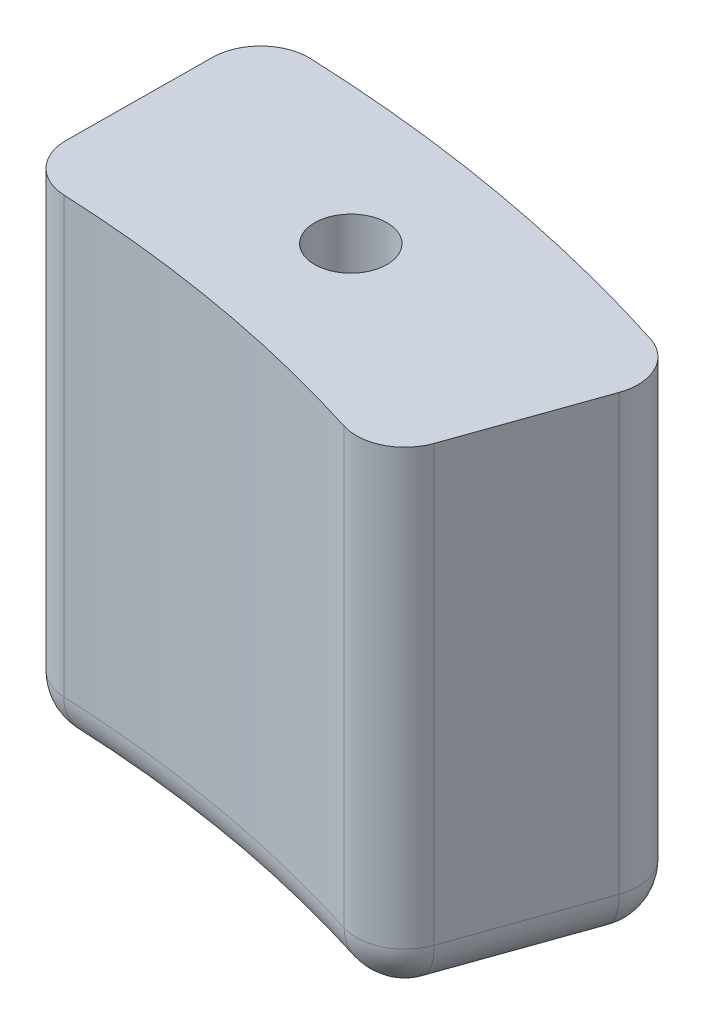
ISO-10303-21;
HEADER;
FILE_DESCRIPTION(('STEP AP214'),'2;1');
FILE_NAME('part.step','',(''),(''),'','','');
FILE_SCHEMA(('AUTOMOTIVE_DESIGN { 1 0 10303 214 1 1 1 1 }'));
ENDSEC;
DATA;
#1=APPLICATION_CONTEXT('core data for automotive mechanical design processes');
#2=APPLICATION_PROTOCOL_DEFINITION('international standard','automotive_design',2000,#1);
#3=PRODUCT_CONTEXT('',#1,'mechanical');
#4=PRODUCT('Part','Part','',(#3));
#5=PRODUCT_RELATED_PRODUCT_CATEGORY('part','',(#4));
#6=PRODUCT_DEFINITION_FORMATION('','',#4);
#7=PRODUCT_DEFINITION_CONTEXT('part definition',#1,'design');
#8=PRODUCT_DEFINITION('design','',#6,#7);
#9=PRODUCT_DEFINITION_SHAPE('','',#8);
#10=(LENGTH_UNIT() NAMED_UNIT(*) SI_UNIT(.MILLI.,.METRE.));
#11=(NAMED_UNIT(*) PLANE_ANGLE_UNIT() SI_UNIT($,.RADIAN.));
#12=(NAMED_UNIT(*) SI_UNIT($,.STERADIAN.) SOLID_ANGLE_UNIT());
#13=UNCERTAINTY_MEASURE_WITH_UNIT(LENGTH_MEASURE(1.E-05),#10,'distance_accuracy_value','');
#14=(GEOMETRIC_REPRESENTATION_CONTEXT(3) GLOBAL_UNCERTAINTY_ASSIGNED_CONTEXT((#13)) GLOBAL_UNIT_ASSIGNED_CONTEXT((#10,
#11,#12)) REPRESENTATION_CONTEXT('',''));
#15=CARTESIAN_POINT('',(0.,0.,0.));
#16=DIRECTION('',(0.,0.,1.));
#17=DIRECTION('',(1.,0.,0.));
#18=AXIS2_PLACEMENT_3D('',#15,#16,#17);
#19=CARTESIAN_POINT('',(0.,20.,0.));
#20=DIRECTION('',(-0.942735748784033,0.,-0.333540564196634));
#21=DIRECTION('',(-0.333540564196634,0.,0.942735748784033));
#22=AXIS2_PLACEMENT_3D('',#19,#20,#21);
#23=PLANE('',#22);
#24=DIRECTION('',(0.333540564196634,0.,-0.942735748784033));
#25=VECTOR('',#24,1.);
#26=CARTESIAN_POINT('',(0.,2.,0.));
#27=LINE('',#26,#25);
#28=CARTESIAN_POINT('',(19.0001053772119,2.,-53.7028490459756));
#29=VERTEX_POINT('',#28);
#30=CARTESIAN_POINT('',(21.0024642858802,2.,-59.3624165101146));
#31=VERTEX_POINT('',#30);
#32=EDGE_CURVE('E159',#29,#31,#27,.T.);
#33=ORIENTED_EDGE('',*,*,#32,.T.);
#34=DIRECTION('',(0.,-1.,0.));
#35=VECTOR('',#34,1.);
#36=CARTESIAN_POINT('',(21.0024642858802,20.,-59.3624165101146));
#37=LINE('',#36,#35);
#38=CARTESIAN_POINT('',(21.0024642858802,20.,-59.3624165101146));
#39=VERTEX_POINT('',#38);
#40=EDGE_CURVE('E161',#31,#39,#37,.F.);
#41=ORIENTED_EDGE('',*,*,#40,.T.);
#42=DIRECTION('',(0.333540564196634,0.,-0.942735748784033));
#43=VECTOR('',#42,1.);
#44=CARTESIAN_POINT('',(0.,20.,0.));
#45=LINE('',#44,#43);
#46=CARTESIAN_POINT('',(19.0001053772119,20.,-53.7028490459756));
#47=VERTEX_POINT('',#46);
#48=EDGE_CURVE('E198',#47,#39,#45,.T.);
#49=ORIENTED_EDGE('',*,*,#48,.F.);
#50=DIRECTION('',(0.,1.,0.));
#51=VECTOR('',#50,1.);
#52=CARTESIAN_POINT('',(19.0001053772119,0.,-53.7028490459756));
#53=LINE('',#52,#51);
#54=EDGE_CURVE('E157',#47,#29,#53,.F.);
#55=ORIENTED_EDGE('',*,*,#54,.T.);
#56=EDGE_LOOP('',(#33,#41,#49,#55));
#57=FACE_BOUND('',#56,.T.);
#58=ADVANCED_FACE('F37',(#57),#23,.F.);
#59=CARTESIAN_POINT('',(0.,20.,0.));
#60=DIRECTION('',(0.,-1.,0.));
#61=DIRECTION('',(0.,0.,-1.));
#62=AXIS2_PLACEMENT_3D('',#59,#60,#61);
#63=CYLINDRICAL_SURFACE('',#62,65.);
#64=CARTESIAN_POINT('',(0.,2.,0.));
#65=DIRECTION('',(0.,1.,0.));
#66=DIRECTION('',(0.,0.,1.));
#67=AXIS2_PLACEMENT_3D('',#64,#65,#66);
#68=CIRCLE('',#67,65.);
#69=CARTESIAN_POINT('',(19.7238814482586,2.,-61.9351959762383));
#70=VERTEX_POINT('',#69);
#71=CARTESIAN_POINT('',(2.64869875451225,2.,-64.9460113856721));
#72=VERTEX_POINT('',#71);
#73=EDGE_CURVE('E142',#70,#72,#68,.T.);
#74=ORIENTED_EDGE('',*,*,#73,.T.);
#75=DIRECTION('',(0.,-1.,0.));
#76=VECTOR('',#75,1.);
#77=CARTESIAN_POINT('',(2.64869875451225,20.,-64.9460113856721));
#78=LINE('',#77,#76);
#79=CARTESIAN_POINT('',(2.64869875451225,20.,-64.9460113856721));
#80=VERTEX_POINT('',#79);
#81=EDGE_CURVE('E138',#72,#80,#78,.F.);
#82=ORIENTED_EDGE('',*,*,#81,.T.);
#83=CARTESIAN_POINT('',(0.,20.,0.));
#84=DIRECTION('',(0.,1.,0.));
#85=DIRECTION('',(0.,0.,1.));
#86=AXIS2_PLACEMENT_3D('',#83,#84,#85);
#87=CIRCLE('',#86,65.);
#88=CARTESIAN_POINT('',(19.7238814482586,20.,-61.9351959762383));
#89=VERTEX_POINT('',#88);
#90=EDGE_CURVE('E134',#89,#80,#87,.T.);
#91=ORIENTED_EDGE('',*,*,#90,.F.);
#92=DIRECTION('',(0.,-1.,0.));
#93=VECTOR('',#92,1.);
#94=CARTESIAN_POINT('',(19.7238814482586,20.,-61.9351959762383));
#95=LINE('',#94,#93);
#96=EDGE_CURVE('E215',#89,#70,#95,.T.);
#97=ORIENTED_EDGE('',*,*,#96,.T.);
#98=EDGE_LOOP('',(#74,#82,#91,#97));
#99=FACE_BOUND('',#98,.T.);
#100=ADVANCED_FACE('F219',(#99),#63,.T.);
#101=CARTESIAN_POINT('',(0.,20.,0.));
#102=DIRECTION('',(-0.999959418054891,0.,-0.009009009009009));
#103=DIRECTION('',(-0.009009009009009,0.,0.999959418054891));
#104=AXIS2_PLACEMENT_3D('',#101,#102,#103);
#105=PLANE('',#104);
#106=DIRECTION('',(0.009009009009009,0.,-0.999959418054891));
#107=VECTOR('',#106,1.);
#108=CARTESIAN_POINT('',(0.,20.,0.));
#109=LINE('',#108,#107);
#110=CARTESIAN_POINT('',(0.513197310581121,20.,-56.9625897279996));
#111=VERTEX_POINT('',#110);
#112=CARTESIAN_POINT('',(0.567281495186708,20.,-62.9656905918232));
#113=VERTEX_POINT('',#112);
#114=EDGE_CURVE('E117',#111,#113,#109,.T.);
#115=ORIENTED_EDGE('',*,*,#114,.T.);
#116=DIRECTION('',(0.,1.,0.));
#117=VECTOR('',#116,1.);
#118=CARTESIAN_POINT('',(0.567281495186709,0.,-62.9656905918232));
#119=LINE('',#118,#117);
#120=CARTESIAN_POINT('',(0.567281495186709,2.,-62.9656905918232));
#121=VERTEX_POINT('',#120);
#122=EDGE_CURVE('E213',#113,#121,#119,.F.);
#123=ORIENTED_EDGE('',*,*,#122,.T.);
#124=DIRECTION('',(0.009009009009009,0.,-0.999959418054891));
#125=VECTOR('',#124,1.);
#126=CARTESIAN_POINT('',(0.495495495495495,2.,-54.997767993019));
#127=LINE('',#126,#125);
#128=CARTESIAN_POINT('',(0.513197310581121,2.,-56.9625897279997));
#129=VERTEX_POINT('',#128);
#130=EDGE_CURVE('E120',#121,#129,#127,.F.);
#131=ORIENTED_EDGE('',*,*,#130,.T.);
#132=DIRECTION('',(0.,-1.,0.));
#133=VECTOR('',#132,1.);
#134=CARTESIAN_POINT('',(0.513197310581121,20.,-56.9625897279996));
#135=LINE('',#134,#133);
#136=EDGE_CURVE('E113',#129,#111,#135,.F.);
#137=ORIENTED_EDGE('',*,*,#136,.T.);
#138=EDGE_LOOP('',(#115,#123,#131,#137));
#139=FACE_BOUND('',#138,.T.);
#140=ADVANCED_FACE('F115',(#139),#105,.T.);
#141=CARTESIAN_POINT('',(0.,20.,0.));
#142=DIRECTION('',(0.,-1.,0.));
#143=DIRECTION('',(0.,0.,-1.));
#144=AXIS2_PLACEMENT_3D('',#141,#142,#143);
#145=CYLINDRICAL_SURFACE('',#144,55.);
#146=CARTESIAN_POINT('',(0.,2.,0.));
#147=DIRECTION('',(0.,1.,0.));
#148=DIRECTION('',(0.,0.,1.));
#149=AXIS2_PLACEMENT_3D('',#146,#147,#148);
#150=CIRCLE('',#149,55.);
#151=CARTESIAN_POINT('',(2.42493663277192,2.,-54.946516562263));
#152=VERTEX_POINT('',#151);
#153=CARTESIAN_POINT('',(16.5141204101826,2.,-52.4622133261454));
#154=VERTEX_POINT('',#153);
#155=EDGE_CURVE('E46',#152,#154,#150,.F.);
#156=ORIENTED_EDGE('',*,*,#155,.T.);
#157=DIRECTION('',(0.,-1.,0.));
#158=VECTOR('',#157,1.);
#159=CARTESIAN_POINT('',(16.5141204101826,20.,-52.4622133261454));
#160=LINE('',#159,#158);
#161=CARTESIAN_POINT('',(16.5141204101826,20.,-52.4622133261454));
#162=VERTEX_POINT('',#161);
#163=EDGE_CURVE('E11',#154,#162,#160,.F.);
#164=ORIENTED_EDGE('',*,*,#163,.T.);
#165=CARTESIAN_POINT('',(0.,20.,0.));
#166=DIRECTION('',(0.,1.,0.));
#167=DIRECTION('',(0.,0.,1.));
#168=AXIS2_PLACEMENT_3D('',#165,#166,#167);
#169=CIRCLE('',#168,55.);
#170=CARTESIAN_POINT('',(2.42493663277192,20.,-54.946516562263));
#171=VERTEX_POINT('',#170);
#172=EDGE_CURVE('E125',#162,#171,#169,.T.);
#173=ORIENTED_EDGE('',*,*,#172,.T.);
#174=DIRECTION('',(0.,-1.,0.));
#175=VECTOR('',#174,1.);
#176=CARTESIAN_POINT('',(2.42493663277192,20.,-54.946516562263));
#177=LINE('',#176,#175);
#178=EDGE_CURVE('E57',#171,#152,#177,.T.);
#179=ORIENTED_EDGE('',*,*,#178,.T.);
#180=EDGE_LOOP('',(#156,#164,#173,#179));
#181=FACE_BOUND('',#180,.T.);
#182=ADVANCED_FACE('F423',(#181),#145,.F.);
#183=CARTESIAN_POINT('',(0.,20.,0.));
#184=DIRECTION('',(0.,1.,0.));
#185=DIRECTION('',(0.,0.,1.));
#186=AXIS2_PLACEMENT_3D('',#183,#184,#185);
#187=PLANE('',#186);
#188=CARTESIAN_POINT('',(10.1115162077173,20.,-59.1418400117977));
#189=DIRECTION('',(0.,1.,0.));
#190=DIRECTION('',(0.,0.,1.));
#191=AXIS2_PLACEMENT_3D('',#188,#189,#190);
#192=CIRCLE('',#191,1.5);
#193=CARTESIAN_POINT('',(10.1115162077173,20.,-57.6418400117977));
#194=VERTEX_POINT('',#193);
#195=EDGE_CURVE('E208',#194,#194,#192,.T.);
#196=ORIENTED_EDGE('',*,*,#195,.F.);
#197=EDGE_LOOP('',(#196));
#198=FACE_BOUND('',#197,.T.);
#199=ORIENTED_EDGE('',*,*,#90,.T.);
#200=CARTESIAN_POINT('',(2.56720033129649,20.,-62.9476725738052));
#201=DIRECTION('',(0.,1.,0.));
#202=DIRECTION('',(0.,0.,1.));
#203=AXIS2_PLACEMENT_3D('',#200,#201,#202);
#204=CIRCLE('',#203,2.);
#205=EDGE_CURVE('E133',#80,#113,#204,.T.);
#206=ORIENTED_EDGE('',*,*,#205,.T.);
#207=ORIENTED_EDGE('',*,*,#114,.F.);
#208=CARTESIAN_POINT('',(2.5131161466909,20.,-56.9445717099816));
#209=DIRECTION('',(0.,1.,0.));
#210=DIRECTION('',(0.,0.,1.));
#211=AXIS2_PLACEMENT_3D('',#208,#209,#210);
#212=CIRCLE('',#211,2.);
#213=EDGE_CURVE('E131',#111,#171,#212,.T.);
#214=ORIENTED_EDGE('',*,*,#213,.T.);
#215=ORIENTED_EDGE('',*,*,#172,.F.);
#216=CARTESIAN_POINT('',(17.1146338796438,20.,-54.3699301743689));
#217=DIRECTION('',(0.,1.,0.));
#218=DIRECTION('',(0.,0.,1.));
#219=AXIS2_PLACEMENT_3D('',#216,#217,#218);
#220=CIRCLE('',#219,2.);
#221=EDGE_CURVE('E137',#162,#47,#220,.T.);
#222=ORIENTED_EDGE('',*,*,#221,.T.);
#223=ORIENTED_EDGE('',*,*,#48,.T.);
#224=CARTESIAN_POINT('',(19.1169927883122,20.,-60.0294976385079));
#225=DIRECTION('',(0.,1.,0.));
#226=DIRECTION('',(0.,0.,1.));
#227=AXIS2_PLACEMENT_3D('',#224,#225,#226);
#228=CIRCLE('',#227,2.);
#229=EDGE_CURVE('E140',#39,#89,#228,.T.);
#230=ORIENTED_EDGE('',*,*,#229,.T.);
#231=EDGE_LOOP('',(#199,#206,#207,#214,#215,#222,#223,#230));
#232=FACE_BOUND('',#231,.T.);
#233=ADVANCED_FACE('F129',(#198,#232),#187,.T.);
#234=CARTESIAN_POINT('',(0.,0.,0.));
#235=DIRECTION('',(0.,1.,0.));
#236=DIRECTION('',(0.,0.,1.));
#237=AXIS2_PLACEMENT_3D('',#234,#235,#236);
#238=PLANE('',#237);
#239=CARTESIAN_POINT('',(0.,0.,0.));
#240=DIRECTION('',(0.,1.,0.));
#241=DIRECTION('',(0.,0.,1.));
#242=AXIS2_PLACEMENT_3D('',#239,#240,#241);
#243=CIRCLE('',#242,57.);
#244=CARTESIAN_POINT('',(17.1146338796438,0.,-54.3699301743689));
#245=VERTEX_POINT('',#244);
#246=CARTESIAN_POINT('',(2.5131161466909,0.,-56.9445717099816));
#247=VERTEX_POINT('',#246);
#248=EDGE_CURVE('E148',#245,#247,#243,.T.);
#249=ORIENTED_EDGE('',*,*,#248,.T.);
#250=DIRECTION('',(0.009009009009009,0.,-0.999959418054891));
#251=VECTOR('',#250,1.);
#252=CARTESIAN_POINT('',(2.58550442169537,0.,-64.9793441555499));
#253=LINE('',#252,#251);
#254=CARTESIAN_POINT('',(2.56720033129649,0.,-62.9476725738052));
#255=VERTEX_POINT('',#254);
#256=EDGE_CURVE('E154',#247,#255,#253,.T.);
#257=ORIENTED_EDGE('',*,*,#256,.T.);
#258=CARTESIAN_POINT('',(0.,0.,0.));
#259=DIRECTION('',(0.,1.,0.));
#260=DIRECTION('',(0.,0.,1.));
#261=AXIS2_PLACEMENT_3D('',#258,#259,#260);
#262=CIRCLE('',#261,63.);
#263=CARTESIAN_POINT('',(19.1169927883121,0.,-60.0294976385079));
#264=VERTEX_POINT('',#263);
#265=EDGE_CURVE('E152',#255,#264,#262,.F.);
#266=ORIENTED_EDGE('',*,*,#265,.T.);
#267=DIRECTION('',(0.333540564196634,0.,-0.942735748784033));
#268=VECTOR('',#267,1.);
#269=CARTESIAN_POINT('',(-1.88547149756807,0.,-0.667081128393269));
#270=LINE('',#269,#268);
#271=EDGE_CURVE('E150',#264,#245,#270,.F.);
#272=ORIENTED_EDGE('',*,*,#271,.T.);
#273=EDGE_LOOP('',(#249,#257,#266,#272));
#274=FACE_BOUND('',#273,.T.);
#275=ADVANCED_FACE('F242',(#274),#238,.F.);
#276=CARTESIAN_POINT('',(17.1146338796438,20.,-54.3699301743689));
#277=DIRECTION('',(0.,-1.,0.));
#278=DIRECTION('',(0.,0.,-1.));
#279=AXIS2_PLACEMENT_3D('',#276,#277,#278);
#280=CYLINDRICAL_SURFACE('',#279,2.);
#281=CARTESIAN_POINT('',(17.1146338796438,2.,-54.3699301743689));
#282=DIRECTION('',(0.,-1.,0.));
#283=DIRECTION('',(0.,0.,-1.));
#284=AXIS2_PLACEMENT_3D('',#281,#282,#283);
#285=CIRCLE('',#284,2.);
#286=EDGE_CURVE('E41',#29,#154,#285,.T.);
#287=ORIENTED_EDGE('',*,*,#286,.F.);
#288=ORIENTED_EDGE('',*,*,#54,.F.);
#289=ORIENTED_EDGE('',*,*,#221,.F.);
#290=ORIENTED_EDGE('',*,*,#163,.F.);
#291=EDGE_LOOP('',(#287,#288,#289,#290));
#292=FACE_BOUND('',#291,.T.);
#293=ADVANCED_FACE('F39',(#292),#280,.T.);
#294=CARTESIAN_POINT('',(17.1146338796438,2.,-54.3699301743689));
#295=DIRECTION('',(0.,-1.,0.));
#296=DIRECTION('',(0.,0.,-1.));
#297=AXIS2_PLACEMENT_3D('',#294,#295,#296);
#298=SPHERICAL_SURFACE('',#297,2.);
#299=CARTESIAN_POINT('',(17.1146338796438,2.,-54.3699301743689));
#300=DIRECTION('',(-0.333540564196634,0.,0.942735748784033));
#301=DIRECTION('',(0.942735748784033,0.,0.333540564196634));
#302=AXIS2_PLACEMENT_3D('',#299,#300,#301);
#303=CIRCLE('',#302,2.);
#304=EDGE_CURVE('E190',#29,#245,#303,.F.);
#305=ORIENTED_EDGE('',*,*,#304,.F.);
#306=ORIENTED_EDGE('',*,*,#286,.T.);
#307=CARTESIAN_POINT('',(17.1146338796438,2.,-54.3699301743689));
#308=DIRECTION('',(0.953858424111735,0.,0.300256734730593));
#309=DIRECTION('',(0.300256734730593,0.,-0.953858424111735));
#310=AXIS2_PLACEMENT_3D('',#307,#308,#309);
#311=CIRCLE('',#310,2.);
#312=EDGE_CURVE('E192',#245,#154,#311,.F.);
#313=ORIENTED_EDGE('',*,*,#312,.F.);
#314=EDGE_LOOP('',(#305,#306,#313));
#315=FACE_BOUND('',#314,.T.);
#316=ADVANCED_FACE('F248',(#315),#298,.T.);
#317=CARTESIAN_POINT('',(2.5131161466909,20.,-56.9445717099816));
#318=DIRECTION('',(0.,-1.,0.));
#319=DIRECTION('',(0.,0.,-1.));
#320=AXIS2_PLACEMENT_3D('',#317,#318,#319);
#321=CYLINDRICAL_SURFACE('',#320,2.);
#322=ORIENTED_EDGE('',*,*,#213,.F.);
#323=ORIENTED_EDGE('',*,*,#136,.F.);
#324=CARTESIAN_POINT('',(2.5131161466909,2.,-56.9445717099816));
#325=DIRECTION('',(0.,-1.,0.));
#326=DIRECTION('',(1.,0.,0.));
#327=AXIS2_PLACEMENT_3D('',#324,#325,#326);
#328=CIRCLE('',#327,2.);
#329=EDGE_CURVE('E188',#152,#129,#328,.T.);
#330=ORIENTED_EDGE('',*,*,#329,.F.);
#331=ORIENTED_EDGE('',*,*,#178,.F.);
#332=EDGE_LOOP('',(#322,#323,#330,#331));
#333=FACE_BOUND('',#332,.T.);
#334=ADVANCED_FACE('F136',(#333),#321,.T.);
#335=CARTESIAN_POINT('',(0.,2.,0.));
#336=DIRECTION('',(0.,1.,0.));
#337=DIRECTION('',(0.,0.,1.));
#338=AXIS2_PLACEMENT_3D('',#335,#336,#337);
#339=TOROIDAL_SURFACE('',#338,57.,2.);
#340=ORIENTED_EDGE('',*,*,#312,.T.);
#341=ORIENTED_EDGE('',*,*,#155,.F.);
#342=CARTESIAN_POINT('',(2.5131161466909,2.,-56.9445717099816));
#343=DIRECTION('',(-0.999027573859327,0.,-0.0440897569594892));
#344=DIRECTION('',(-0.0440897569594892,0.,0.999027573859327));
#345=AXIS2_PLACEMENT_3D('',#342,#343,#344);
#346=CIRCLE('',#345,2.);
#347=EDGE_CURVE('E185',#247,#152,#346,.T.);
#348=ORIENTED_EDGE('',*,*,#347,.F.);
#349=ORIENTED_EDGE('',*,*,#248,.F.);
#350=EDGE_LOOP('',(#340,#341,#348,#349));
#351=FACE_BOUND('',#350,.T.);
#352=ADVANCED_FACE('F240',(#351),#339,.T.);
#353=CARTESIAN_POINT('',(-1.88547149756807,2.,-0.667081128393269));
#354=DIRECTION('',(0.333540564196634,0.,-0.942735748784033));
#355=DIRECTION('',(-0.942735748784033,0.,-0.333540564196634));
#356=AXIS2_PLACEMENT_3D('',#353,#354,#355);
#357=CYLINDRICAL_SURFACE('',#356,2.);
#358=ORIENTED_EDGE('',*,*,#304,.T.);
#359=ORIENTED_EDGE('',*,*,#271,.F.);
#360=CARTESIAN_POINT('',(19.1169927883122,2.,-60.0294976385079));
#361=DIRECTION('',(0.333540564196634,0.,-0.942735748784033));
#362=DIRECTION('',(-0.942735748784033,0.,-0.333540564196634));
#363=AXIS2_PLACEMENT_3D('',#360,#361,#362);
#364=CIRCLE('',#363,2.);
#365=EDGE_CURVE('E182',#31,#264,#364,.T.);
#366=ORIENTED_EDGE('',*,*,#365,.F.);
#367=ORIENTED_EDGE('',*,*,#32,.F.);
#368=EDGE_LOOP('',(#358,#359,#366,#367));
#369=FACE_BOUND('',#368,.T.);
#370=ADVANCED_FACE('F247',(#369),#357,.T.);
#371=CARTESIAN_POINT('',(19.1169927883122,20.,-60.0294976385079));
#372=DIRECTION('',(0.,-1.,0.));
#373=DIRECTION('',(0.,0.,-1.));
#374=AXIS2_PLACEMENT_3D('',#371,#372,#373);
#375=CYLINDRICAL_SURFACE('',#374,2.);
#376=ORIENTED_EDGE('',*,*,#229,.F.);
#377=ORIENTED_EDGE('',*,*,#40,.F.);
#378=CARTESIAN_POINT('',(19.1169927883122,2.,-60.0294976385079));
#379=DIRECTION('',(0.,-1.,0.));
#380=DIRECTION('',(0.,0.,-1.));
#381=AXIS2_PLACEMENT_3D('',#378,#379,#380);
#382=CIRCLE('',#381,2.);
#383=EDGE_CURVE('E179',#70,#31,#382,.T.);
#384=ORIENTED_EDGE('',*,*,#383,.F.);
#385=ORIENTED_EDGE('',*,*,#96,.F.);
#386=EDGE_LOOP('',(#376,#377,#384,#385));
#387=FACE_BOUND('',#386,.T.);
#388=ADVANCED_FACE('F280',(#387),#375,.T.);
#389=CARTESIAN_POINT('',(2.5131161466909,2.,-56.9445717099816));
#390=DIRECTION('',(0.,-1.,0.));
#391=DIRECTION('',(0.,0.,-1.));
#392=AXIS2_PLACEMENT_3D('',#389,#390,#391);
#393=SPHERICAL_SURFACE('',#392,2.);
#394=ORIENTED_EDGE('',*,*,#347,.T.);
#395=ORIENTED_EDGE('',*,*,#329,.T.);
#396=CARTESIAN_POINT('',(2.5131161466909,2.,-56.9445717099816));
#397=DIRECTION('',(-0.00900900900900961,0.,0.999959418054891));
#398=DIRECTION('',(0.999959418054891,0.,0.00900900900900961));
#399=AXIS2_PLACEMENT_3D('',#396,#397,#398);
#400=CIRCLE('',#399,2.);
#401=EDGE_CURVE('E176',#247,#129,#400,.F.);
#402=ORIENTED_EDGE('',*,*,#401,.F.);
#403=EDGE_LOOP('',(#394,#395,#402));
#404=FACE_BOUND('',#403,.T.);
#405=ADVANCED_FACE('F238',(#404),#393,.T.);
#406=CARTESIAN_POINT('',(19.1169927883122,2.,-60.0294976385079));
#407=DIRECTION('',(0.,-1.,0.));
#408=DIRECTION('',(0.,0.,-1.));
#409=AXIS2_PLACEMENT_3D('',#406,#407,#408);
#410=SPHERICAL_SURFACE('',#409,2.);
#411=ORIENTED_EDGE('',*,*,#383,.T.);
#412=ORIENTED_EDGE('',*,*,#365,.T.);
#413=CARTESIAN_POINT('',(19.1169927883121,2.,-60.0294976385079));
#414=DIRECTION('',(0.952849168865204,0.,0.303444329973209));
#415=DIRECTION('',(0.303444329973209,0.,-0.952849168865204));
#416=AXIS2_PLACEMENT_3D('',#413,#414,#415);
#417=CIRCLE('',#416,2.);
#418=EDGE_CURVE('E173',#70,#264,#417,.F.);
#419=ORIENTED_EDGE('',*,*,#418,.F.);
#420=EDGE_LOOP('',(#411,#412,#419));
#421=FACE_BOUND('',#420,.T.);
#422=ADVANCED_FACE('F274',(#421),#410,.T.);
#423=CARTESIAN_POINT('',(1.99991883610978,2.,0.018018018018018));
#424=DIRECTION('',(-0.009009009009009,0.,0.999959418054891));
#425=DIRECTION('',(0.999959418054891,0.,0.009009009009009));
#426=AXIS2_PLACEMENT_3D('',#423,#424,#425);
#427=CYLINDRICAL_SURFACE('',#426,2.);
#428=ORIENTED_EDGE('',*,*,#401,.T.);
#429=ORIENTED_EDGE('',*,*,#130,.F.);
#430=CARTESIAN_POINT('',(2.56720033129649,2.,-62.9476725738052));
#431=DIRECTION('',(0.00900900900900614,0.,-0.999959418054891));
#432=DIRECTION('',(-0.999959418054891,0.,-0.00900900900900614));
#433=AXIS2_PLACEMENT_3D('',#430,#431,#432);
#434=CIRCLE('',#433,2.);
#435=EDGE_CURVE('E170',#255,#121,#434,.T.);
#436=ORIENTED_EDGE('',*,*,#435,.F.);
#437=ORIENTED_EDGE('',*,*,#256,.F.);
#438=EDGE_LOOP('',(#428,#429,#436,#437));
#439=FACE_BOUND('',#438,.T.);
#440=ADVANCED_FACE('F235',(#439),#427,.T.);
#441=CARTESIAN_POINT('',(0.,2.,0.));
#442=DIRECTION('',(0.,1.,0.));
#443=DIRECTION('',(0.,0.,1.));
#444=AXIS2_PLACEMENT_3D('',#441,#442,#443);
#445=TOROIDAL_SURFACE('',#444,63.,2.);
#446=ORIENTED_EDGE('',*,*,#418,.T.);
#447=ORIENTED_EDGE('',*,*,#265,.F.);
#448=CARTESIAN_POINT('',(2.56720033129649,2.,-62.9476725738052));
#449=DIRECTION('',(-0.999169405933416,0.,-0.040749211607881));
#450=DIRECTION('',(-0.040749211607881,0.,0.999169405933416));
#451=AXIS2_PLACEMENT_3D('',#448,#449,#450);
#452=CIRCLE('',#451,2.);
#453=EDGE_CURVE('E167',#72,#255,#452,.T.);
#454=ORIENTED_EDGE('',*,*,#453,.F.);
#455=ORIENTED_EDGE('',*,*,#73,.F.);
#456=EDGE_LOOP('',(#446,#447,#454,#455));
#457=FACE_BOUND('',#456,.T.);
#458=ADVANCED_FACE('F226',(#457),#445,.T.);
#459=CARTESIAN_POINT('',(2.56720033129649,2.,-62.9476725738052));
#460=DIRECTION('',(0.,-1.,0.));
#461=DIRECTION('',(0.,0.,-1.));
#462=AXIS2_PLACEMENT_3D('',#459,#460,#461);
#463=SPHERICAL_SURFACE('',#462,2.);
#464=ORIENTED_EDGE('',*,*,#453,.T.);
#465=ORIENTED_EDGE('',*,*,#435,.T.);
#466=CARTESIAN_POINT('',(2.56720033129649,2.,-62.9476725738052));
#467=DIRECTION('',(0.,-1.,0.));
#468=DIRECTION('',(0.,0.,-1.));
#469=AXIS2_PLACEMENT_3D('',#466,#467,#468);
#470=CIRCLE('',#469,2.);
#471=EDGE_CURVE('E165',#72,#121,#470,.F.);
#472=ORIENTED_EDGE('',*,*,#471,.F.);
#473=EDGE_LOOP('',(#464,#465,#472));
#474=FACE_BOUND('',#473,.T.);
#475=ADVANCED_FACE('F232',(#474),#463,.T.);
#476=CARTESIAN_POINT('',(2.56720033129649,20.,-62.9476725738052));
#477=DIRECTION('',(0.,-1.,0.));
#478=DIRECTION('',(0.,0.,-1.));
#479=AXIS2_PLACEMENT_3D('',#476,#477,#478);
#480=CYLINDRICAL_SURFACE('',#479,2.);
#481=ORIENTED_EDGE('',*,*,#205,.F.);
#482=ORIENTED_EDGE('',*,*,#81,.F.);
#483=ORIENTED_EDGE('',*,*,#471,.T.);
#484=ORIENTED_EDGE('',*,*,#122,.F.);
#485=EDGE_LOOP('',(#481,#482,#483,#484));
#486=FACE_BOUND('',#485,.T.);
#487=ADVANCED_FACE('F231',(#486),#480,.T.);
#488=CARTESIAN_POINT('',(10.1115162077173,10.,-59.1418400117977));
#489=DIRECTION('',(0.,1.,0.));
#490=DIRECTION('',(0.,0.,1.));
#491=AXIS2_PLACEMENT_3D('',#488,#489,#490);
#492=CYLINDRICAL_SURFACE('',#491,1.5);
#493=CARTESIAN_POINT('',(10.1115162077173,10.,-59.1418400117977));
#494=DIRECTION('',(0.,1.,0.));
#495=DIRECTION('',(0.,0.,1.));
#496=AXIS2_PLACEMENT_3D('',#493,#494,#495);
#497=CIRCLE('',#496,1.5);
#498=CARTESIAN_POINT('',(10.1115162077173,10.,-57.6418400117977));
#499=VERTEX_POINT('',#498);
#500=EDGE_CURVE('E168',#499,#499,#497,.T.);
#501=ORIENTED_EDGE('',*,*,#500,.F.);
#502=EDGE_LOOP('',(#501));
#503=FACE_BOUND('',#502,.T.);
#504=ORIENTED_EDGE('',*,*,#195,.T.);
#505=EDGE_LOOP('',(#504));
#506=FACE_BOUND('',#505,.T.);
#507=ADVANCED_FACE('F267',(#503,#506),#492,.F.);
#508=CARTESIAN_POINT('',(0.,10.,0.));
#509=DIRECTION('',(0.,1.,0.));
#510=DIRECTION('',(0.,0.,1.));
#511=AXIS2_PLACEMENT_3D('',#508,#509,#510);
#512=PLANE('',#511);
#513=ORIENTED_EDGE('',*,*,#500,.T.);
#514=EDGE_LOOP('',(#513));
#515=FACE_BOUND('',#514,.T.);
#516=ADVANCED_FACE('F330',(#515),#512,.T.);
#517=CLOSED_SHELL('',(#58,#100,#140,#182,#233,#275,#293,#316,#334,#352,#370,#388,#405,#422,#440,
#458,#475,#487,#507,#516));
#518=MANIFOLD_SOLID_BREP('B2',#517);
#519=ADVANCED_BREP_SHAPE_REPRESENTATION('',(#18,#518),#14);
#520=SHAPE_DEFINITION_REPRESENTATION(#9,#519);
ENDSEC;
END-ISO-10303-21;
